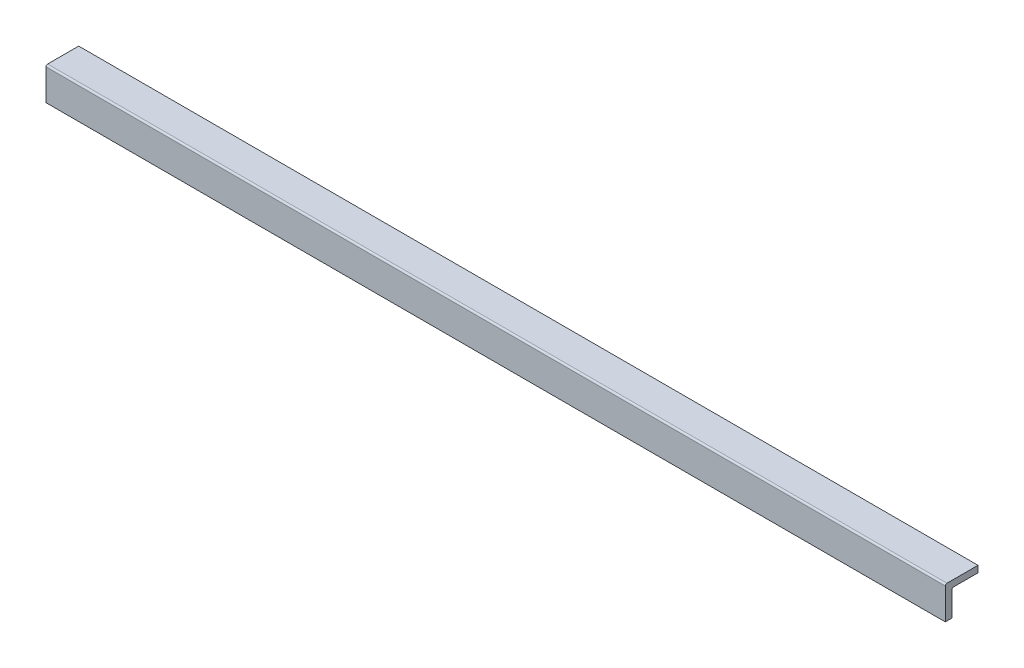
ISO-10303-21;
HEADER;
FILE_DESCRIPTION(('STEP AP214'),'2;1');
FILE_NAME('part.step','',(''),(''),'','','');
FILE_SCHEMA(('AUTOMOTIVE_DESIGN { 1 0 10303 214 1 1 1 1 }'));
ENDSEC;
DATA;
#1=APPLICATION_CONTEXT('core data for automotive mechanical design processes');
#2=APPLICATION_PROTOCOL_DEFINITION('international standard','automotive_design',2000,#1);
#3=PRODUCT_CONTEXT('',#1,'mechanical');
#4=PRODUCT('Part','Part','',(#3));
#5=PRODUCT_RELATED_PRODUCT_CATEGORY('part','',(#4));
#6=PRODUCT_DEFINITION_FORMATION('','',#4);
#7=PRODUCT_DEFINITION_CONTEXT('part definition',#1,'design');
#8=PRODUCT_DEFINITION('design','',#6,#7);
#9=PRODUCT_DEFINITION_SHAPE('','',#8);
#10=(LENGTH_UNIT() NAMED_UNIT(*) SI_UNIT(.MILLI.,.METRE.));
#11=(NAMED_UNIT(*) PLANE_ANGLE_UNIT() SI_UNIT($,.RADIAN.));
#12=(NAMED_UNIT(*) SI_UNIT($,.STERADIAN.) SOLID_ANGLE_UNIT());
#13=UNCERTAINTY_MEASURE_WITH_UNIT(LENGTH_MEASURE(1.E-05),#10,'distance_accuracy_value','');
#14=(GEOMETRIC_REPRESENTATION_CONTEXT(3) GLOBAL_UNCERTAINTY_ASSIGNED_CONTEXT((#13)) GLOBAL_UNIT_ASSIGNED_CONTEXT((#10,
#11,#12)) REPRESENTATION_CONTEXT('',''));
#15=CARTESIAN_POINT('',(0.,0.,0.));
#16=DIRECTION('',(0.,0.,1.));
#17=DIRECTION('',(1.,0.,0.));
#18=AXIS2_PLACEMENT_3D('',#15,#16,#17);
#19=CARTESIAN_POINT('',(-137.5,-10.,0.));
#20=DIRECTION('',(0.,-1.,0.));
#21=DIRECTION('',(0.,0.,-1.));
#22=AXIS2_PLACEMENT_3D('',#19,#20,#21);
#23=PLANE('',#22);
#24=DIRECTION('',(1.,0.,0.));
#25=VECTOR('',#24,1.);
#26=CARTESIAN_POINT('',(-137.5,-10.,-2.));
#27=LINE('',#26,#25);
#28=CARTESIAN_POINT('',(-137.5,-10.,-2.));
#29=VERTEX_POINT('',#28);
#30=CARTESIAN_POINT('',(137.5,-10.,-2.));
#31=VERTEX_POINT('',#30);
#32=EDGE_CURVE('E48',#29,#31,#27,.T.);
#33=ORIENTED_EDGE('',*,*,#32,.T.);
#34=DIRECTION('',(0.,0.,-1.));
#35=VECTOR('',#34,1.);
#36=CARTESIAN_POINT('',(137.5,-10.,0.));
#37=LINE('',#36,#35);
#38=CARTESIAN_POINT('',(137.5,-10.,0.));
#39=VERTEX_POINT('',#38);
#40=EDGE_CURVE('E110',#39,#31,#37,.T.);
#41=ORIENTED_EDGE('',*,*,#40,.F.);
#42=DIRECTION('',(1.,0.,0.));
#43=VECTOR('',#42,1.);
#44=CARTESIAN_POINT('',(-137.5,-10.,0.));
#45=LINE('',#44,#43);
#46=CARTESIAN_POINT('',(-137.5,-10.,0.));
#47=VERTEX_POINT('',#46);
#48=EDGE_CURVE('E11',#47,#39,#45,.T.);
#49=ORIENTED_EDGE('',*,*,#48,.F.);
#50=DIRECTION('',(0.,0.,-1.));
#51=VECTOR('',#50,1.);
#52=CARTESIAN_POINT('',(-137.5,-10.,0.));
#53=LINE('',#52,#51);
#54=EDGE_CURVE('E111',#47,#29,#53,.T.);
#55=ORIENTED_EDGE('',*,*,#54,.T.);
#56=EDGE_LOOP('',(#33,#41,#49,#55));
#57=FACE_BOUND('',#56,.T.);
#58=ADVANCED_FACE('F45',(#57),#23,.T.);
#59=CARTESIAN_POINT('',(-137.5,-10.,0.));
#60=DIRECTION('',(0.,0.,1.));
#61=DIRECTION('',(1.,0.,0.));
#62=AXIS2_PLACEMENT_3D('',#59,#60,#61);
#63=PLANE('',#62);
#64=ORIENTED_EDGE('',*,*,#48,.T.);
#65=DIRECTION('',(0.,-1.,0.));
#66=VECTOR('',#65,1.);
#67=CARTESIAN_POINT('',(137.5,-10.,0.));
#68=LINE('',#67,#66);
#69=CARTESIAN_POINT('',(137.5,-0.500000000000004,0.));
#70=VERTEX_POINT('',#69);
#71=EDGE_CURVE('E130',#70,#39,#68,.T.);
#72=ORIENTED_EDGE('',*,*,#71,.F.);
#73=DIRECTION('',(1.,0.,0.));
#74=VECTOR('',#73,1.);
#75=CARTESIAN_POINT('',(-137.5,-0.500000000000004,0.));
#76=LINE('',#75,#74);
#77=CARTESIAN_POINT('',(-137.5,-0.500000000000004,0.));
#78=VERTEX_POINT('',#77);
#79=EDGE_CURVE('E54',#78,#70,#76,.T.);
#80=ORIENTED_EDGE('',*,*,#79,.F.);
#81=DIRECTION('',(0.,-1.,0.));
#82=VECTOR('',#81,1.);
#83=CARTESIAN_POINT('',(-137.5,-10.,0.));
#84=LINE('',#83,#82);
#85=EDGE_CURVE('E117',#78,#47,#84,.T.);
#86=ORIENTED_EDGE('',*,*,#85,.T.);
#87=EDGE_LOOP('',(#64,#72,#80,#86));
#88=FACE_BOUND('',#87,.T.);
#89=ADVANCED_FACE('F215',(#88),#63,.T.);
#90=CARTESIAN_POINT('',(-137.5,-0.5,-0.5));
#91=DIRECTION('',(1.,0.,0.));
#92=DIRECTION('',(0.,0.,-1.));
#93=AXIS2_PLACEMENT_3D('',#90,#91,#92);
#94=CYLINDRICAL_SURFACE('',#93,0.5);
#95=ORIENTED_EDGE('',*,*,#79,.T.);
#96=CARTESIAN_POINT('',(137.5,-0.5,-0.5));
#97=DIRECTION('',(1.,0.,0.));
#98=DIRECTION('',(0.,0.,1.));
#99=AXIS2_PLACEMENT_3D('',#96,#97,#98);
#100=CIRCLE('',#99,0.5);
#101=CARTESIAN_POINT('',(137.5,0.,-0.500000000000003));
#102=VERTEX_POINT('',#101);
#103=EDGE_CURVE('E148',#102,#70,#100,.T.);
#104=ORIENTED_EDGE('',*,*,#103,.F.);
#105=DIRECTION('',(1.,0.,0.));
#106=VECTOR('',#105,1.);
#107=CARTESIAN_POINT('',(-137.5,0.,-0.500000000000003));
#108=LINE('',#107,#106);
#109=CARTESIAN_POINT('',(-137.5,0.,-0.500000000000003));
#110=VERTEX_POINT('',#109);
#111=EDGE_CURVE('E181',#110,#102,#108,.T.);
#112=ORIENTED_EDGE('',*,*,#111,.F.);
#113=CARTESIAN_POINT('',(-137.5,-0.5,-0.5));
#114=DIRECTION('',(1.,0.,0.));
#115=DIRECTION('',(0.,0.,1.));
#116=AXIS2_PLACEMENT_3D('',#113,#114,#115);
#117=CIRCLE('',#116,0.5);
#118=EDGE_CURVE('E174',#110,#78,#117,.T.);
#119=ORIENTED_EDGE('',*,*,#118,.T.);
#120=EDGE_LOOP('',(#95,#104,#112,#119));
#121=FACE_BOUND('',#120,.T.);
#122=ADVANCED_FACE('F214',(#121),#94,.T.);
#123=CARTESIAN_POINT('',(-137.5,0.,-0.500000000000004));
#124=DIRECTION('',(0.,1.,0.));
#125=DIRECTION('',(0.,0.,1.));
#126=AXIS2_PLACEMENT_3D('',#123,#124,#125);
#127=PLANE('',#126);
#128=ORIENTED_EDGE('',*,*,#111,.T.);
#129=DIRECTION('',(0.,0.,1.));
#130=VECTOR('',#129,1.);
#131=CARTESIAN_POINT('',(137.5,0.,-0.500000000000004));
#132=LINE('',#131,#130);
#133=CARTESIAN_POINT('',(137.5,0.,-10.));
#134=VERTEX_POINT('',#133);
#135=EDGE_CURVE('E144',#134,#102,#132,.T.);
#136=ORIENTED_EDGE('',*,*,#135,.F.);
#137=DIRECTION('',(1.,0.,0.));
#138=VECTOR('',#137,1.);
#139=CARTESIAN_POINT('',(-137.5,0.,-10.));
#140=LINE('',#139,#138);
#141=CARTESIAN_POINT('',(-137.5,0.,-10.));
#142=VERTEX_POINT('',#141);
#143=EDGE_CURVE('E184',#142,#134,#140,.T.);
#144=ORIENTED_EDGE('',*,*,#143,.F.);
#145=DIRECTION('',(0.,0.,1.));
#146=VECTOR('',#145,1.);
#147=CARTESIAN_POINT('',(-137.5,0.,-0.500000000000004));
#148=LINE('',#147,#146);
#149=EDGE_CURVE('E170',#142,#110,#148,.T.);
#150=ORIENTED_EDGE('',*,*,#149,.T.);
#151=EDGE_LOOP('',(#128,#136,#144,#150));
#152=FACE_BOUND('',#151,.T.);
#153=ADVANCED_FACE('F210',(#152),#127,.T.);
#154=CARTESIAN_POINT('',(-137.5,0.,-10.));
#155=DIRECTION('',(0.,0.,-1.));
#156=DIRECTION('',(-1.,0.,0.));
#157=AXIS2_PLACEMENT_3D('',#154,#155,#156);
#158=PLANE('',#157);
#159=ORIENTED_EDGE('',*,*,#143,.T.);
#160=DIRECTION('',(0.,1.,0.));
#161=VECTOR('',#160,1.);
#162=CARTESIAN_POINT('',(137.5,0.,-10.));
#163=LINE('',#162,#161);
#164=CARTESIAN_POINT('',(137.5,-2.,-10.));
#165=VERTEX_POINT('',#164);
#166=EDGE_CURVE('E140',#165,#134,#163,.T.);
#167=ORIENTED_EDGE('',*,*,#166,.F.);
#168=DIRECTION('',(1.,0.,0.));
#169=VECTOR('',#168,1.);
#170=CARTESIAN_POINT('',(-137.5,-2.,-10.));
#171=LINE('',#170,#169);
#172=CARTESIAN_POINT('',(-137.5,-2.,-10.));
#173=VERTEX_POINT('',#172);
#174=EDGE_CURVE('E187',#173,#165,#171,.T.);
#175=ORIENTED_EDGE('',*,*,#174,.F.);
#176=DIRECTION('',(0.,1.,0.));
#177=VECTOR('',#176,1.);
#178=CARTESIAN_POINT('',(-137.5,0.,-10.));
#179=LINE('',#178,#177);
#180=EDGE_CURVE('E166',#173,#142,#179,.T.);
#181=ORIENTED_EDGE('',*,*,#180,.T.);
#182=EDGE_LOOP('',(#159,#167,#175,#181));
#183=FACE_BOUND('',#182,.T.);
#184=ADVANCED_FACE('F203',(#183),#158,.T.);
#185=CARTESIAN_POINT('',(-137.5,-2.,-10.));
#186=DIRECTION('',(0.,-1.,0.));
#187=DIRECTION('',(0.,0.,-1.));
#188=AXIS2_PLACEMENT_3D('',#185,#186,#187);
#189=PLANE('',#188);
#190=ORIENTED_EDGE('',*,*,#174,.T.);
#191=DIRECTION('',(0.,0.,-1.));
#192=VECTOR('',#191,1.);
#193=CARTESIAN_POINT('',(137.5,-2.,-10.));
#194=LINE('',#193,#192);
#195=CARTESIAN_POINT('',(137.5,-2.,-2.5));
#196=VERTEX_POINT('',#195);
#197=EDGE_CURVE('E136',#196,#165,#194,.T.);
#198=ORIENTED_EDGE('',*,*,#197,.F.);
#199=DIRECTION('',(1.,0.,0.));
#200=VECTOR('',#199,1.);
#201=CARTESIAN_POINT('',(-137.5,-2.,-2.5));
#202=LINE('',#201,#200);
#203=CARTESIAN_POINT('',(-137.5,-2.,-2.5));
#204=VERTEX_POINT('',#203);
#205=EDGE_CURVE('E190',#204,#196,#202,.T.);
#206=ORIENTED_EDGE('',*,*,#205,.F.);
#207=DIRECTION('',(0.,0.,-1.));
#208=VECTOR('',#207,1.);
#209=CARTESIAN_POINT('',(-137.5,-2.,-10.));
#210=LINE('',#209,#208);
#211=EDGE_CURVE('E162',#204,#173,#210,.T.);
#212=ORIENTED_EDGE('',*,*,#211,.T.);
#213=EDGE_LOOP('',(#190,#198,#206,#212));
#214=FACE_BOUND('',#213,.T.);
#215=ADVANCED_FACE('F200',(#214),#189,.T.);
#216=CARTESIAN_POINT('',(-137.5,-2.5,-2.5));
#217=DIRECTION('',(1.,0.,0.));
#218=DIRECTION('',(0.,0.,-1.));
#219=AXIS2_PLACEMENT_3D('',#216,#217,#218);
#220=CYLINDRICAL_SURFACE('',#219,0.5);
#221=ORIENTED_EDGE('',*,*,#205,.T.);
#222=CARTESIAN_POINT('',(137.5,-2.5,-2.5));
#223=DIRECTION('',(-1.,0.,0.));
#224=DIRECTION('',(0.,0.,-1.));
#225=AXIS2_PLACEMENT_3D('',#222,#223,#224);
#226=CIRCLE('',#225,0.5);
#227=CARTESIAN_POINT('',(137.5,-2.5,-2.));
#228=VERTEX_POINT('',#227);
#229=EDGE_CURVE('E125',#228,#196,#226,.T.);
#230=ORIENTED_EDGE('',*,*,#229,.F.);
#231=DIRECTION('',(1.,0.,0.));
#232=VECTOR('',#231,1.);
#233=CARTESIAN_POINT('',(-137.5,-2.5,-2.));
#234=LINE('',#233,#232);
#235=CARTESIAN_POINT('',(-137.5,-2.5,-2.));
#236=VERTEX_POINT('',#235);
#237=EDGE_CURVE('E116',#236,#228,#234,.T.);
#238=ORIENTED_EDGE('',*,*,#237,.F.);
#239=CARTESIAN_POINT('',(-137.5,-2.5,-2.5));
#240=DIRECTION('',(-1.,0.,0.));
#241=DIRECTION('',(0.,0.,-1.));
#242=AXIS2_PLACEMENT_3D('',#239,#240,#241);
#243=CIRCLE('',#242,0.5);
#244=EDGE_CURVE('E158',#236,#204,#243,.T.);
#245=ORIENTED_EDGE('',*,*,#244,.T.);
#246=EDGE_LOOP('',(#221,#230,#238,#245));
#247=FACE_BOUND('',#246,.T.);
#248=ADVANCED_FACE('F194',(#247),#220,.F.);
#249=CARTESIAN_POINT('',(-137.5,-10.,-2.));
#250=DIRECTION('',(0.,0.,-1.));
#251=DIRECTION('',(-1.,0.,0.));
#252=AXIS2_PLACEMENT_3D('',#249,#250,#251);
#253=PLANE('',#252);
#254=ORIENTED_EDGE('',*,*,#237,.T.);
#255=DIRECTION('',(0.,1.,0.));
#256=VECTOR('',#255,1.);
#257=CARTESIAN_POINT('',(137.5,-10.,-2.));
#258=LINE('',#257,#256);
#259=EDGE_CURVE('E119',#31,#228,#258,.T.);
#260=ORIENTED_EDGE('',*,*,#259,.F.);
#261=ORIENTED_EDGE('',*,*,#32,.F.);
#262=DIRECTION('',(0.,1.,0.));
#263=VECTOR('',#262,1.);
#264=CARTESIAN_POINT('',(-137.5,-10.,-2.));
#265=LINE('',#264,#263);
#266=EDGE_CURVE('E155',#29,#236,#265,.T.);
#267=ORIENTED_EDGE('',*,*,#266,.T.);
#268=EDGE_LOOP('',(#254,#260,#261,#267));
#269=FACE_BOUND('',#268,.T.);
#270=ADVANCED_FACE('F120',(#269),#253,.T.);
#271=CARTESIAN_POINT('',(-137.5,-2.5,-2.5));
#272=DIRECTION('',(1.,0.,0.));
#273=DIRECTION('',(0.,0.,-1.));
#274=AXIS2_PLACEMENT_3D('',#271,#272,#273);
#275=PLANE('',#274);
#276=ORIENTED_EDGE('',*,*,#54,.F.);
#277=ORIENTED_EDGE('',*,*,#85,.F.);
#278=ORIENTED_EDGE('',*,*,#118,.F.);
#279=ORIENTED_EDGE('',*,*,#149,.F.);
#280=ORIENTED_EDGE('',*,*,#180,.F.);
#281=ORIENTED_EDGE('',*,*,#211,.F.);
#282=ORIENTED_EDGE('',*,*,#244,.F.);
#283=ORIENTED_EDGE('',*,*,#266,.F.);
#284=EDGE_LOOP('',(#276,#277,#278,#279,#280,#281,#282,#283));
#285=FACE_BOUND('',#284,.T.);
#286=ADVANCED_FACE('F206',(#285),#275,.F.);
#287=CARTESIAN_POINT('',(137.5,-2.5,-2.5));
#288=DIRECTION('',(1.,0.,0.));
#289=DIRECTION('',(0.,0.,-1.));
#290=AXIS2_PLACEMENT_3D('',#287,#288,#289);
#291=PLANE('',#290);
#292=ORIENTED_EDGE('',*,*,#40,.T.);
#293=ORIENTED_EDGE('',*,*,#259,.T.);
#294=ORIENTED_EDGE('',*,*,#229,.T.);
#295=ORIENTED_EDGE('',*,*,#197,.T.);
#296=ORIENTED_EDGE('',*,*,#166,.T.);
#297=ORIENTED_EDGE('',*,*,#135,.T.);
#298=ORIENTED_EDGE('',*,*,#103,.T.);
#299=ORIENTED_EDGE('',*,*,#71,.T.);
#300=EDGE_LOOP('',(#292,#293,#294,#295,#296,#297,#298,#299));
#301=FACE_BOUND('',#300,.T.);
#302=ADVANCED_FACE('F128',(#301),#291,.T.);
#303=CLOSED_SHELL('',(#58,#89,#122,#153,#184,#215,#248,#270,#286,#302));
#304=MANIFOLD_SOLID_BREP('B2',#303);
#305=ADVANCED_BREP_SHAPE_REPRESENTATION('',(#18,#304),#14);
#306=SHAPE_DEFINITION_REPRESENTATION(#9,#305);
ENDSEC;
END-ISO-10303-21;
